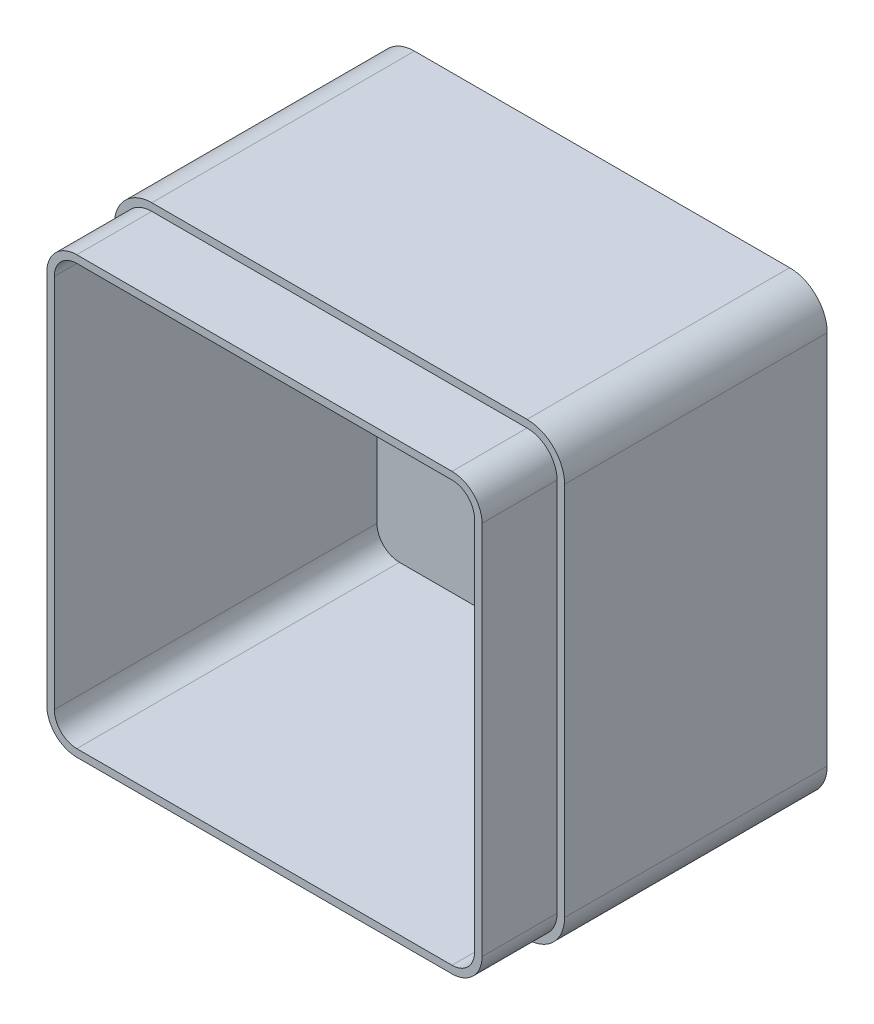
ISO-10303-21;
HEADER;
FILE_DESCRIPTION(('STEP AP214'),'2;1');
FILE_NAME('part.step','',(''),(''),'','','');
FILE_SCHEMA(('AUTOMOTIVE_DESIGN { 1 0 10303 214 1 1 1 1 }'));
ENDSEC;
DATA;
#1=APPLICATION_CONTEXT('core data for automotive mechanical design processes');
#2=APPLICATION_PROTOCOL_DEFINITION('international standard','automotive_design',2000,#1);
#3=PRODUCT_CONTEXT('',#1,'mechanical');
#4=PRODUCT('Part','Part','',(#3));
#5=PRODUCT_RELATED_PRODUCT_CATEGORY('part','',(#4));
#6=PRODUCT_DEFINITION_FORMATION('','',#4);
#7=PRODUCT_DEFINITION_CONTEXT('part definition',#1,'design');
#8=PRODUCT_DEFINITION('design','',#6,#7);
#9=PRODUCT_DEFINITION_SHAPE('','',#8);
#10=(LENGTH_UNIT() NAMED_UNIT(*) SI_UNIT(.MILLI.,.METRE.));
#11=(NAMED_UNIT(*) PLANE_ANGLE_UNIT() SI_UNIT($,.RADIAN.));
#12=(NAMED_UNIT(*) SI_UNIT($,.STERADIAN.) SOLID_ANGLE_UNIT());
#13=UNCERTAINTY_MEASURE_WITH_UNIT(LENGTH_MEASURE(1.E-05),#10,'distance_accuracy_value','');
#14=(GEOMETRIC_REPRESENTATION_CONTEXT(3) GLOBAL_UNCERTAINTY_ASSIGNED_CONTEXT((#13)) GLOBAL_UNIT_ASSIGNED_CONTEXT((#10,
#11,#12)) REPRESENTATION_CONTEXT('',''));
#15=CARTESIAN_POINT('',(0.,0.,0.));
#16=DIRECTION('',(0.,0.,1.));
#17=DIRECTION('',(1.,0.,0.));
#18=AXIS2_PLACEMENT_3D('',#15,#16,#17);
#19=CARTESIAN_POINT('',(0.,0.,90.));
#20=DIRECTION('',(0.,0.,-1.));
#21=DIRECTION('',(-1.,0.,0.));
#22=AXIS2_PLACEMENT_3D('',#19,#20,#21);
#23=PLANE('',#22);
#24=DIRECTION('',(0.,-1.,0.));
#25=VECTOR('',#24,1.);
#26=CARTESIAN_POINT('',(4.,0.,90.));
#27=LINE('',#26,#25);
#28=CARTESIAN_POINT('',(3.99999999999996,110.,90.));
#29=VERTEX_POINT('',#28);
#30=CARTESIAN_POINT('',(4.,10.,90.));
#31=VERTEX_POINT('',#30);
#32=EDGE_CURVE('E302',#29,#31,#27,.T.);
#33=ORIENTED_EDGE('',*,*,#32,.F.);
#34=CARTESIAN_POINT('',(9.99999999999996,110.,90.));
#35=DIRECTION('',(0.,0.,-1.));
#36=DIRECTION('',(-1.,0.,0.));
#37=AXIS2_PLACEMENT_3D('',#34,#35,#36);
#38=CIRCLE('',#37,6.);
#39=CARTESIAN_POINT('',(9.99999999999996,116.,90.));
#40=VERTEX_POINT('',#39);
#41=EDGE_CURVE('E331',#40,#29,#38,.F.);
#42=ORIENTED_EDGE('',*,*,#41,.F.);
#43=DIRECTION('',(-1.,0.,0.));
#44=VECTOR('',#43,1.);
#45=CARTESIAN_POINT('',(0.,116.,90.));
#46=LINE('',#45,#44);
#47=CARTESIAN_POINT('',(110.,116.,90.));
#48=VERTEX_POINT('',#47);
#49=EDGE_CURVE('E313',#48,#40,#46,.T.);
#50=ORIENTED_EDGE('',*,*,#49,.F.);
#51=CARTESIAN_POINT('',(110.,110.,90.));
#52=DIRECTION('',(0.,0.,-1.));
#53=DIRECTION('',(-1.,0.,0.));
#54=AXIS2_PLACEMENT_3D('',#51,#52,#53);
#55=CIRCLE('',#54,6.);
#56=CARTESIAN_POINT('',(116.,110.,90.));
#57=VERTEX_POINT('',#56);
#58=EDGE_CURVE('E287',#57,#48,#55,.F.);
#59=ORIENTED_EDGE('',*,*,#58,.F.);
#60=DIRECTION('',(0.,1.,0.));
#61=VECTOR('',#60,1.);
#62=CARTESIAN_POINT('',(116.,0.,90.));
#63=LINE('',#62,#61);
#64=CARTESIAN_POINT('',(116.,10.,90.));
#65=VERTEX_POINT('',#64);
#66=EDGE_CURVE('E334',#65,#57,#63,.T.);
#67=ORIENTED_EDGE('',*,*,#66,.F.);
#68=CARTESIAN_POINT('',(110.,10.,90.));
#69=DIRECTION('',(0.,0.,-1.));
#70=DIRECTION('',(-1.,0.,0.));
#71=AXIS2_PLACEMENT_3D('',#68,#69,#70);
#72=CIRCLE('',#71,6.);
#73=CARTESIAN_POINT('',(110.,4.,90.));
#74=VERTEX_POINT('',#73);
#75=EDGE_CURVE('E335',#74,#65,#72,.F.);
#76=ORIENTED_EDGE('',*,*,#75,.F.);
#77=DIRECTION('',(1.,0.,0.));
#78=VECTOR('',#77,1.);
#79=CARTESIAN_POINT('',(0.,4.,90.));
#80=LINE('',#79,#78);
#81=CARTESIAN_POINT('',(9.99999999999999,4.,90.));
#82=VERTEX_POINT('',#81);
#83=EDGE_CURVE('E329',#82,#74,#80,.T.);
#84=ORIENTED_EDGE('',*,*,#83,.F.);
#85=CARTESIAN_POINT('',(9.99999999999999,10.,90.));
#86=DIRECTION('',(0.,0.,-1.));
#87=DIRECTION('',(-1.,0.,0.));
#88=AXIS2_PLACEMENT_3D('',#85,#86,#87);
#89=CIRCLE('',#88,6.);
#90=EDGE_CURVE('E324',#31,#82,#89,.F.);
#91=ORIENTED_EDGE('',*,*,#90,.F.);
#92=EDGE_LOOP('',(#33,#42,#50,#59,#67,#76,#84,#91));
#93=FACE_BOUND('',#92,.T.);
#94=CARTESIAN_POINT('',(9.99999999999996,110.,90.));
#95=DIRECTION('',(0.,0.,1.));
#96=DIRECTION('',(1.,0.,0.));
#97=AXIS2_PLACEMENT_3D('',#94,#95,#96);
#98=CIRCLE('',#97,8.);
#99=CARTESIAN_POINT('',(9.99999999999995,118.,90.));
#100=VERTEX_POINT('',#99);
#101=CARTESIAN_POINT('',(1.99999999999996,110.,90.));
#102=VERTEX_POINT('',#101);
#103=EDGE_CURVE('E239',#100,#102,#98,.T.);
#104=ORIENTED_EDGE('',*,*,#103,.T.);
#105=DIRECTION('',(0.,-1.,0.));
#106=VECTOR('',#105,1.);
#107=CARTESIAN_POINT('',(1.99999999999996,110.,90.));
#108=LINE('',#107,#106);
#109=CARTESIAN_POINT('',(1.99999999999996,9.99999999999999,90.));
#110=VERTEX_POINT('',#109);
#111=EDGE_CURVE('E199',#102,#110,#108,.T.);
#112=ORIENTED_EDGE('',*,*,#111,.T.);
#113=CARTESIAN_POINT('',(9.99999999999999,10.,90.));
#114=DIRECTION('',(0.,0.,1.));
#115=DIRECTION('',(1.,0.,0.));
#116=AXIS2_PLACEMENT_3D('',#113,#114,#115);
#117=CIRCLE('',#116,8.00000000000001);
#118=CARTESIAN_POINT('',(9.99999999999999,1.99999999999998,90.));
#119=VERTEX_POINT('',#118);
#120=EDGE_CURVE('E48',#110,#119,#117,.T.);
#121=ORIENTED_EDGE('',*,*,#120,.T.);
#122=DIRECTION('',(1.,0.,0.));
#123=VECTOR('',#122,1.);
#124=CARTESIAN_POINT('',(9.99999999999999,2.,90.));
#125=LINE('',#124,#123);
#126=CARTESIAN_POINT('',(110.,2.,90.));
#127=VERTEX_POINT('',#126);
#128=EDGE_CURVE('E243',#119,#127,#125,.T.);
#129=ORIENTED_EDGE('',*,*,#128,.T.);
#130=CARTESIAN_POINT('',(110.,10.,90.));
#131=DIRECTION('',(0.,0.,1.));
#132=DIRECTION('',(1.,0.,0.));
#133=AXIS2_PLACEMENT_3D('',#130,#131,#132);
#134=CIRCLE('',#133,7.99999999999999);
#135=CARTESIAN_POINT('',(118.,10.,90.));
#136=VERTEX_POINT('',#135);
#137=EDGE_CURVE('E246',#127,#136,#134,.T.);
#138=ORIENTED_EDGE('',*,*,#137,.T.);
#139=DIRECTION('',(0.,1.,0.));
#140=VECTOR('',#139,1.);
#141=CARTESIAN_POINT('',(118.,9.99999999999999,90.));
#142=LINE('',#141,#140);
#143=CARTESIAN_POINT('',(118.,110.,90.));
#144=VERTEX_POINT('',#143);
#145=EDGE_CURVE('E249',#136,#144,#142,.T.);
#146=ORIENTED_EDGE('',*,*,#145,.T.);
#147=CARTESIAN_POINT('',(110.,110.,90.));
#148=DIRECTION('',(0.,0.,1.));
#149=DIRECTION('',(1.,0.,0.));
#150=AXIS2_PLACEMENT_3D('',#147,#148,#149);
#151=CIRCLE('',#150,8.00000000000001);
#152=CARTESIAN_POINT('',(110.,118.,90.));
#153=VERTEX_POINT('',#152);
#154=EDGE_CURVE('E222',#144,#153,#151,.T.);
#155=ORIENTED_EDGE('',*,*,#154,.T.);
#156=DIRECTION('',(-1.,0.,0.));
#157=VECTOR('',#156,1.);
#158=CARTESIAN_POINT('',(110.,118.,90.));
#159=LINE('',#158,#157);
#160=EDGE_CURVE('E219',#153,#100,#159,.T.);
#161=ORIENTED_EDGE('',*,*,#160,.T.);
#162=EDGE_LOOP('',(#104,#112,#121,#129,#138,#146,#155,#161));
#163=FACE_BOUND('',#162,.T.);
#164=ADVANCED_FACE('F33',(#93,#163),#23,.F.);
#165=CARTESIAN_POINT('',(4.,0.,90.));
#166=DIRECTION('',(1.,0.,0.));
#167=DIRECTION('',(0.,1.,0.));
#168=AXIS2_PLACEMENT_3D('',#165,#166,#167);
#169=PLANE('',#168);
#170=DIRECTION('',(0.,-1.,0.));
#171=VECTOR('',#170,1.);
#172=CARTESIAN_POINT('',(4.,0.,4.));
#173=LINE('',#172,#171);
#174=CARTESIAN_POINT('',(3.99999999999996,110.,4.));
#175=VERTEX_POINT('',#174);
#176=CARTESIAN_POINT('',(4.,10.,4.));
#177=VERTEX_POINT('',#176);
#178=EDGE_CURVE('E281',#175,#177,#173,.T.);
#179=ORIENTED_EDGE('',*,*,#178,.F.);
#180=DIRECTION('',(0.,0.,1.));
#181=VECTOR('',#180,1.);
#182=CARTESIAN_POINT('',(3.99999999999996,110.,90.));
#183=LINE('',#182,#181);
#184=EDGE_CURVE('E288',#29,#175,#183,.F.);
#185=ORIENTED_EDGE('',*,*,#184,.F.);
#186=ORIENTED_EDGE('',*,*,#32,.T.);
#187=DIRECTION('',(0.,0.,1.));
#188=VECTOR('',#187,1.);
#189=CARTESIAN_POINT('',(4.,10.,90.));
#190=LINE('',#189,#188);
#191=EDGE_CURVE('E285',#177,#31,#190,.T.);
#192=ORIENTED_EDGE('',*,*,#191,.F.);
#193=EDGE_LOOP('',(#179,#185,#186,#192));
#194=FACE_BOUND('',#193,.T.);
#195=ADVANCED_FACE('F427',(#194),#169,.T.);
#196=CARTESIAN_POINT('',(0.,4.,90.));
#197=DIRECTION('',(0.,1.,0.));
#198=DIRECTION('',(0.,0.,1.));
#199=AXIS2_PLACEMENT_3D('',#196,#197,#198);
#200=PLANE('',#199);
#201=ORIENTED_EDGE('',*,*,#83,.T.);
#202=DIRECTION('',(0.,0.,1.));
#203=VECTOR('',#202,1.);
#204=CARTESIAN_POINT('',(110.,4.,90.));
#205=LINE('',#204,#203);
#206=CARTESIAN_POINT('',(110.,4.,4.));
#207=VERTEX_POINT('',#206);
#208=EDGE_CURVE('E311',#207,#74,#205,.T.);
#209=ORIENTED_EDGE('',*,*,#208,.F.);
#210=DIRECTION('',(1.,0.,0.));
#211=VECTOR('',#210,1.);
#212=CARTESIAN_POINT('',(0.,4.,4.));
#213=LINE('',#212,#211);
#214=CARTESIAN_POINT('',(9.99999999999999,4.,4.));
#215=VERTEX_POINT('',#214);
#216=EDGE_CURVE('E284',#215,#207,#213,.T.);
#217=ORIENTED_EDGE('',*,*,#216,.F.);
#218=DIRECTION('',(0.,0.,1.));
#219=VECTOR('',#218,1.);
#220=CARTESIAN_POINT('',(9.99999999999999,4.,90.));
#221=LINE('',#220,#219);
#222=EDGE_CURVE('E305',#82,#215,#221,.F.);
#223=ORIENTED_EDGE('',*,*,#222,.F.);
#224=EDGE_LOOP('',(#201,#209,#217,#223));
#225=FACE_BOUND('',#224,.T.);
#226=ADVANCED_FACE('F432',(#225),#200,.T.);
#227=CARTESIAN_POINT('',(116.,0.,90.));
#228=DIRECTION('',(-1.,0.,0.));
#229=DIRECTION('',(0.,-1.,0.));
#230=AXIS2_PLACEMENT_3D('',#227,#228,#229);
#231=PLANE('',#230);
#232=ORIENTED_EDGE('',*,*,#66,.T.);
#233=DIRECTION('',(0.,0.,1.));
#234=VECTOR('',#233,1.);
#235=CARTESIAN_POINT('',(116.,110.,90.));
#236=LINE('',#235,#234);
#237=CARTESIAN_POINT('',(116.,110.,4.));
#238=VERTEX_POINT('',#237);
#239=EDGE_CURVE('E318',#238,#57,#236,.T.);
#240=ORIENTED_EDGE('',*,*,#239,.F.);
#241=DIRECTION('',(0.,1.,0.));
#242=VECTOR('',#241,1.);
#243=CARTESIAN_POINT('',(116.,0.,4.));
#244=LINE('',#243,#242);
#245=CARTESIAN_POINT('',(116.,10.,4.));
#246=VERTEX_POINT('',#245);
#247=EDGE_CURVE('E294',#246,#238,#244,.T.);
#248=ORIENTED_EDGE('',*,*,#247,.F.);
#249=DIRECTION('',(0.,0.,1.));
#250=VECTOR('',#249,1.);
#251=CARTESIAN_POINT('',(116.,10.,90.));
#252=LINE('',#251,#250);
#253=EDGE_CURVE('E314',#65,#246,#252,.F.);
#254=ORIENTED_EDGE('',*,*,#253,.F.);
#255=EDGE_LOOP('',(#232,#240,#248,#254));
#256=FACE_BOUND('',#255,.T.);
#257=ADVANCED_FACE('F461',(#256),#231,.T.);
#258=CARTESIAN_POINT('',(0.,116.,90.));
#259=DIRECTION('',(0.,-1.,0.));
#260=DIRECTION('',(0.,0.,-1.));
#261=AXIS2_PLACEMENT_3D('',#258,#259,#260);
#262=PLANE('',#261);
#263=DIRECTION('',(-1.,0.,0.));
#264=VECTOR('',#263,1.);
#265=CARTESIAN_POINT('',(0.,116.,4.));
#266=LINE('',#265,#264);
#267=CARTESIAN_POINT('',(110.,116.,4.));
#268=VERTEX_POINT('',#267);
#269=CARTESIAN_POINT('',(9.99999999999996,116.,4.));
#270=VERTEX_POINT('',#269);
#271=EDGE_CURVE('E299',#268,#270,#266,.T.);
#272=ORIENTED_EDGE('',*,*,#271,.F.);
#273=DIRECTION('',(0.,0.,-1.));
#274=VECTOR('',#273,1.);
#275=CARTESIAN_POINT('',(110.,116.,90.));
#276=LINE('',#275,#274);
#277=EDGE_CURVE('E321',#48,#268,#276,.T.);
#278=ORIENTED_EDGE('',*,*,#277,.F.);
#279=ORIENTED_EDGE('',*,*,#49,.T.);
#280=DIRECTION('',(0.,0.,-1.));
#281=VECTOR('',#280,1.);
#282=CARTESIAN_POINT('',(9.99999999999996,116.,90.));
#283=LINE('',#282,#281);
#284=EDGE_CURVE('E320',#270,#40,#283,.F.);
#285=ORIENTED_EDGE('',*,*,#284,.F.);
#286=EDGE_LOOP('',(#272,#278,#279,#285));
#287=FACE_BOUND('',#286,.T.);
#288=ADVANCED_FACE('F457',(#287),#262,.T.);
#289=CARTESIAN_POINT('',(0.,0.,4.));
#290=DIRECTION('',(0.,0.,-1.));
#291=DIRECTION('',(-1.,0.,0.));
#292=AXIS2_PLACEMENT_3D('',#289,#290,#291);
#293=PLANE('',#292);
#294=ORIENTED_EDGE('',*,*,#216,.T.);
#295=CARTESIAN_POINT('',(110.,10.,4.));
#296=DIRECTION('',(0.,0.,-1.));
#297=DIRECTION('',(-1.,0.,0.));
#298=AXIS2_PLACEMENT_3D('',#295,#296,#297);
#299=CIRCLE('',#298,6.);
#300=EDGE_CURVE('E298',#246,#207,#299,.T.);
#301=ORIENTED_EDGE('',*,*,#300,.F.);
#302=ORIENTED_EDGE('',*,*,#247,.T.);
#303=CARTESIAN_POINT('',(110.,110.,4.));
#304=DIRECTION('',(0.,0.,-1.));
#305=DIRECTION('',(-1.,0.,0.));
#306=AXIS2_PLACEMENT_3D('',#303,#304,#305);
#307=CIRCLE('',#306,6.);
#308=EDGE_CURVE('E303',#268,#238,#307,.T.);
#309=ORIENTED_EDGE('',*,*,#308,.F.);
#310=ORIENTED_EDGE('',*,*,#271,.T.);
#311=CARTESIAN_POINT('',(9.99999999999996,110.,4.));
#312=DIRECTION('',(0.,0.,-1.));
#313=DIRECTION('',(-1.,0.,0.));
#314=AXIS2_PLACEMENT_3D('',#311,#312,#313);
#315=CIRCLE('',#314,6.);
#316=EDGE_CURVE('E296',#175,#270,#315,.T.);
#317=ORIENTED_EDGE('',*,*,#316,.F.);
#318=ORIENTED_EDGE('',*,*,#178,.T.);
#319=CARTESIAN_POINT('',(9.99999999999999,10.,4.));
#320=DIRECTION('',(0.,0.,-1.));
#321=DIRECTION('',(-1.,0.,0.));
#322=AXIS2_PLACEMENT_3D('',#319,#320,#321);
#323=CIRCLE('',#322,6.);
#324=EDGE_CURVE('E291',#215,#177,#323,.T.);
#325=ORIENTED_EDGE('',*,*,#324,.F.);
#326=EDGE_LOOP('',(#294,#301,#302,#309,#310,#317,#318,#325));
#327=FACE_BOUND('',#326,.T.);
#328=ADVANCED_FACE('F453',(#327),#293,.F.);
#329=CARTESIAN_POINT('',(9.99999999999999,10.,90.));
#330=DIRECTION('',(0.,0.,-1.));
#331=DIRECTION('',(-1.,0.,0.));
#332=AXIS2_PLACEMENT_3D('',#329,#330,#331);
#333=CYLINDRICAL_SURFACE('',#332,6.);
#334=ORIENTED_EDGE('',*,*,#90,.T.);
#335=ORIENTED_EDGE('',*,*,#222,.T.);
#336=ORIENTED_EDGE('',*,*,#324,.T.);
#337=ORIENTED_EDGE('',*,*,#191,.T.);
#338=EDGE_LOOP('',(#334,#335,#336,#337));
#339=FACE_BOUND('',#338,.T.);
#340=ADVANCED_FACE('F449',(#339),#333,.F.);
#341=CARTESIAN_POINT('',(9.99999999999996,110.,90.));
#342=DIRECTION('',(0.,0.,-1.));
#343=DIRECTION('',(-1.,0.,0.));
#344=AXIS2_PLACEMENT_3D('',#341,#342,#343);
#345=CYLINDRICAL_SURFACE('',#344,6.);
#346=ORIENTED_EDGE('',*,*,#41,.T.);
#347=ORIENTED_EDGE('',*,*,#184,.T.);
#348=ORIENTED_EDGE('',*,*,#316,.T.);
#349=ORIENTED_EDGE('',*,*,#284,.T.);
#350=EDGE_LOOP('',(#346,#347,#348,#349));
#351=FACE_BOUND('',#350,.T.);
#352=ADVANCED_FACE('F445',(#351),#345,.F.);
#353=CARTESIAN_POINT('',(110.,10.,90.));
#354=DIRECTION('',(0.,0.,-1.));
#355=DIRECTION('',(-1.,0.,0.));
#356=AXIS2_PLACEMENT_3D('',#353,#354,#355);
#357=CYLINDRICAL_SURFACE('',#356,6.);
#358=ORIENTED_EDGE('',*,*,#75,.T.);
#359=ORIENTED_EDGE('',*,*,#253,.T.);
#360=ORIENTED_EDGE('',*,*,#300,.T.);
#361=ORIENTED_EDGE('',*,*,#208,.T.);
#362=EDGE_LOOP('',(#358,#359,#360,#361));
#363=FACE_BOUND('',#362,.T.);
#364=ADVANCED_FACE('F441',(#363),#357,.F.);
#365=CARTESIAN_POINT('',(110.,110.,90.));
#366=DIRECTION('',(0.,0.,-1.));
#367=DIRECTION('',(-1.,0.,0.));
#368=AXIS2_PLACEMENT_3D('',#365,#366,#367);
#369=CYLINDRICAL_SURFACE('',#368,6.);
#370=ORIENTED_EDGE('',*,*,#58,.T.);
#371=ORIENTED_EDGE('',*,*,#277,.T.);
#372=ORIENTED_EDGE('',*,*,#308,.T.);
#373=ORIENTED_EDGE('',*,*,#239,.T.);
#374=EDGE_LOOP('',(#370,#371,#372,#373));
#375=FACE_BOUND('',#374,.T.);
#376=ADVANCED_FACE('F438',(#375),#369,.F.);
#377=CARTESIAN_POINT('',(9.99999999999996,110.,70.));
#378=DIRECTION('',(0.,0.,1.));
#379=DIRECTION('',(1.,0.,0.));
#380=AXIS2_PLACEMENT_3D('',#377,#378,#379);
#381=PLANE('',#380);
#382=DIRECTION('',(-1.,0.,0.));
#383=VECTOR('',#382,1.);
#384=CARTESIAN_POINT('',(110.,118.,70.));
#385=LINE('',#384,#383);
#386=CARTESIAN_POINT('',(110.,118.,70.));
#387=VERTEX_POINT('',#386);
#388=CARTESIAN_POINT('',(9.99999999999995,118.,70.));
#389=VERTEX_POINT('',#388);
#390=EDGE_CURVE('E205',#387,#389,#385,.T.);
#391=ORIENTED_EDGE('',*,*,#390,.F.);
#392=CARTESIAN_POINT('',(110.,110.,70.));
#393=DIRECTION('',(0.,0.,1.));
#394=DIRECTION('',(1.,0.,0.));
#395=AXIS2_PLACEMENT_3D('',#392,#393,#394);
#396=CIRCLE('',#395,8.00000000000001);
#397=CARTESIAN_POINT('',(118.,110.,70.));
#398=VERTEX_POINT('',#397);
#399=EDGE_CURVE('E235',#398,#387,#396,.T.);
#400=ORIENTED_EDGE('',*,*,#399,.F.);
#401=DIRECTION('',(0.,1.,0.));
#402=VECTOR('',#401,1.);
#403=CARTESIAN_POINT('',(118.,9.99999999999999,70.));
#404=LINE('',#403,#402);
#405=CARTESIAN_POINT('',(118.,10.,70.));
#406=VERTEX_POINT('',#405);
#407=EDGE_CURVE('E232',#406,#398,#404,.T.);
#408=ORIENTED_EDGE('',*,*,#407,.F.);
#409=CARTESIAN_POINT('',(110.,10.,70.));
#410=DIRECTION('',(0.,0.,1.));
#411=DIRECTION('',(1.,0.,0.));
#412=AXIS2_PLACEMENT_3D('',#409,#410,#411);
#413=CIRCLE('',#412,7.99999999999999);
#414=CARTESIAN_POINT('',(110.,2.,70.));
#415=VERTEX_POINT('',#414);
#416=EDGE_CURVE('E229',#415,#406,#413,.T.);
#417=ORIENTED_EDGE('',*,*,#416,.F.);
#418=DIRECTION('',(1.,0.,0.));
#419=VECTOR('',#418,1.);
#420=CARTESIAN_POINT('',(9.99999999999999,2.,70.));
#421=LINE('',#420,#419);
#422=CARTESIAN_POINT('',(9.99999999999999,1.99999999999998,70.));
#423=VERTEX_POINT('',#422);
#424=EDGE_CURVE('E226',#423,#415,#421,.T.);
#425=ORIENTED_EDGE('',*,*,#424,.F.);
#426=CARTESIAN_POINT('',(9.99999999999999,10.,70.));
#427=DIRECTION('',(0.,0.,1.));
#428=DIRECTION('',(1.,0.,0.));
#429=AXIS2_PLACEMENT_3D('',#426,#427,#428);
#430=CIRCLE('',#429,8.00000000000001);
#431=CARTESIAN_POINT('',(1.99999999999996,9.99999999999999,70.));
#432=VERTEX_POINT('',#431);
#433=EDGE_CURVE('E215',#432,#423,#430,.T.);
#434=ORIENTED_EDGE('',*,*,#433,.F.);
#435=DIRECTION('',(0.,-1.,0.));
#436=VECTOR('',#435,1.);
#437=CARTESIAN_POINT('',(1.99999999999996,110.,70.));
#438=LINE('',#437,#436);
#439=CARTESIAN_POINT('',(1.99999999999996,110.,70.));
#440=VERTEX_POINT('',#439);
#441=EDGE_CURVE('E197',#440,#432,#438,.T.);
#442=ORIENTED_EDGE('',*,*,#441,.F.);
#443=CARTESIAN_POINT('',(9.99999999999996,110.,70.));
#444=DIRECTION('',(0.,0.,1.));
#445=DIRECTION('',(1.,0.,0.));
#446=AXIS2_PLACEMENT_3D('',#443,#444,#445);
#447=CIRCLE('',#446,8.);
#448=EDGE_CURVE('E211',#389,#440,#447,.T.);
#449=ORIENTED_EDGE('',*,*,#448,.F.);
#450=EDGE_LOOP('',(#391,#400,#408,#417,#425,#434,#442,#449));
#451=FACE_BOUND('',#450,.T.);
#452=CARTESIAN_POINT('',(9.99999999999996,110.,70.));
#453=DIRECTION('',(0.,0.,1.));
#454=DIRECTION('',(1.,0.,0.));
#455=AXIS2_PLACEMENT_3D('',#452,#453,#454);
#456=CIRCLE('',#455,10.);
#457=CARTESIAN_POINT('',(9.99999999999996,120.,70.));
#458=VERTEX_POINT('',#457);
#459=CARTESIAN_POINT('',(0.,110.,70.));
#460=VERTEX_POINT('',#459);
#461=EDGE_CURVE('E255',#458,#460,#456,.T.);
#462=ORIENTED_EDGE('',*,*,#461,.T.);
#463=DIRECTION('',(0.,-1.,0.));
#464=VECTOR('',#463,1.);
#465=CARTESIAN_POINT('',(0.,110.,70.));
#466=LINE('',#465,#464);
#467=CARTESIAN_POINT('',(0.,9.99999999999999,70.));
#468=VERTEX_POINT('',#467);
#469=EDGE_CURVE('E268',#460,#468,#466,.T.);
#470=ORIENTED_EDGE('',*,*,#469,.T.);
#471=CARTESIAN_POINT('',(9.99999999999999,10.,70.));
#472=DIRECTION('',(0.,0.,1.));
#473=DIRECTION('',(1.,0.,0.));
#474=AXIS2_PLACEMENT_3D('',#471,#472,#473);
#475=CIRCLE('',#474,10.);
#476=CARTESIAN_POINT('',(9.99999999999999,0.,70.));
#477=VERTEX_POINT('',#476);
#478=EDGE_CURVE('E270',#468,#477,#475,.T.);
#479=ORIENTED_EDGE('',*,*,#478,.T.);
#480=DIRECTION('',(1.,0.,0.));
#481=VECTOR('',#480,1.);
#482=CARTESIAN_POINT('',(9.99999999999999,0.,70.));
#483=LINE('',#482,#481);
#484=CARTESIAN_POINT('',(110.,0.,70.));
#485=VERTEX_POINT('',#484);
#486=EDGE_CURVE('E272',#477,#485,#483,.T.);
#487=ORIENTED_EDGE('',*,*,#486,.T.);
#488=CARTESIAN_POINT('',(110.,10.,70.));
#489=DIRECTION('',(0.,0.,1.));
#490=DIRECTION('',(1.,0.,0.));
#491=AXIS2_PLACEMENT_3D('',#488,#489,#490);
#492=CIRCLE('',#491,9.99999999999999);
#493=CARTESIAN_POINT('',(120.,10.,70.));
#494=VERTEX_POINT('',#493);
#495=EDGE_CURVE('E274',#485,#494,#492,.T.);
#496=ORIENTED_EDGE('',*,*,#495,.T.);
#497=DIRECTION('',(0.,1.,0.));
#498=VECTOR('',#497,1.);
#499=CARTESIAN_POINT('',(120.,10.,70.));
#500=LINE('',#499,#498);
#501=CARTESIAN_POINT('',(120.,110.,70.));
#502=VERTEX_POINT('',#501);
#503=EDGE_CURVE('E56',#494,#502,#500,.T.);
#504=ORIENTED_EDGE('',*,*,#503,.T.);
#505=CARTESIAN_POINT('',(110.,110.,70.));
#506=DIRECTION('',(0.,0.,1.));
#507=DIRECTION('',(1.,0.,0.));
#508=AXIS2_PLACEMENT_3D('',#505,#506,#507);
#509=CIRCLE('',#508,9.99999999999999);
#510=CARTESIAN_POINT('',(110.,120.,70.));
#511=VERTEX_POINT('',#510);
#512=EDGE_CURVE('E277',#502,#511,#509,.T.);
#513=ORIENTED_EDGE('',*,*,#512,.T.);
#514=DIRECTION('',(-1.,0.,0.));
#515=VECTOR('',#514,1.);
#516=CARTESIAN_POINT('',(110.,120.,70.));
#517=LINE('',#516,#515);
#518=EDGE_CURVE('E279',#511,#458,#517,.T.);
#519=ORIENTED_EDGE('',*,*,#518,.T.);
#520=EDGE_LOOP('',(#462,#470,#479,#487,#496,#504,#513,#519));
#521=FACE_BOUND('',#520,.T.);
#522=ADVANCED_FACE('F210',(#451,#521),#381,.T.);
#523=CARTESIAN_POINT('',(9.99999999999996,110.,70.));
#524=DIRECTION('',(0.,0.,1.));
#525=DIRECTION('',(1.,0.,0.));
#526=AXIS2_PLACEMENT_3D('',#523,#524,#525);
#527=CYLINDRICAL_SURFACE('',#526,8.);
#528=ORIENTED_EDGE('',*,*,#103,.F.);
#529=DIRECTION('',(0.,0.,1.));
#530=VECTOR('',#529,1.);
#531=CARTESIAN_POINT('',(9.99999999999995,118.,70.));
#532=LINE('',#531,#530);
#533=EDGE_CURVE('E218',#389,#100,#532,.T.);
#534=ORIENTED_EDGE('',*,*,#533,.F.);
#535=ORIENTED_EDGE('',*,*,#448,.T.);
#536=DIRECTION('',(0.,0.,1.));
#537=VECTOR('',#536,1.);
#538=CARTESIAN_POINT('',(1.99999999999996,110.,70.));
#539=LINE('',#538,#537);
#540=EDGE_CURVE('E194',#440,#102,#539,.T.);
#541=ORIENTED_EDGE('',*,*,#540,.T.);
#542=EDGE_LOOP('',(#528,#534,#535,#541));
#543=FACE_BOUND('',#542,.T.);
#544=ADVANCED_FACE('F217',(#543),#527,.T.);
#545=CARTESIAN_POINT('',(110.,118.,70.));
#546=DIRECTION('',(0.,1.,0.));
#547=DIRECTION('',(0.,0.,1.));
#548=AXIS2_PLACEMENT_3D('',#545,#546,#547);
#549=PLANE('',#548);
#550=ORIENTED_EDGE('',*,*,#160,.F.);
#551=DIRECTION('',(0.,0.,1.));
#552=VECTOR('',#551,1.);
#553=CARTESIAN_POINT('',(110.,118.,70.));
#554=LINE('',#553,#552);
#555=EDGE_CURVE('E256',#387,#153,#554,.T.);
#556=ORIENTED_EDGE('',*,*,#555,.F.);
#557=ORIENTED_EDGE('',*,*,#390,.T.);
#558=ORIENTED_EDGE('',*,*,#533,.T.);
#559=EDGE_LOOP('',(#550,#556,#557,#558));
#560=FACE_BOUND('',#559,.T.);
#561=ADVANCED_FACE('F472',(#560),#549,.T.);
#562=CARTESIAN_POINT('',(110.,110.,70.));
#563=DIRECTION('',(0.,0.,1.));
#564=DIRECTION('',(1.,0.,0.));
#565=AXIS2_PLACEMENT_3D('',#562,#563,#564);
#566=CYLINDRICAL_SURFACE('',#565,8.00000000000001);
#567=ORIENTED_EDGE('',*,*,#154,.F.);
#568=DIRECTION('',(0.,0.,1.));
#569=VECTOR('',#568,1.);
#570=CARTESIAN_POINT('',(118.,110.,70.));
#571=LINE('',#570,#569);
#572=EDGE_CURVE('E258',#398,#144,#571,.T.);
#573=ORIENTED_EDGE('',*,*,#572,.F.);
#574=ORIENTED_EDGE('',*,*,#399,.T.);
#575=ORIENTED_EDGE('',*,*,#555,.T.);
#576=EDGE_LOOP('',(#567,#573,#574,#575));
#577=FACE_BOUND('',#576,.T.);
#578=ADVANCED_FACE('F487',(#577),#566,.T.);
#579=CARTESIAN_POINT('',(118.,9.99999999999999,70.));
#580=DIRECTION('',(1.,0.,0.));
#581=DIRECTION('',(0.,0.,-1.));
#582=AXIS2_PLACEMENT_3D('',#579,#580,#581);
#583=PLANE('',#582);
#584=ORIENTED_EDGE('',*,*,#145,.F.);
#585=DIRECTION('',(0.,0.,1.));
#586=VECTOR('',#585,1.);
#587=CARTESIAN_POINT('',(118.,10.,70.));
#588=LINE('',#587,#586);
#589=EDGE_CURVE('E260',#406,#136,#588,.T.);
#590=ORIENTED_EDGE('',*,*,#589,.F.);
#591=ORIENTED_EDGE('',*,*,#407,.T.);
#592=ORIENTED_EDGE('',*,*,#572,.T.);
#593=EDGE_LOOP('',(#584,#590,#591,#592));
#594=FACE_BOUND('',#593,.T.);
#595=ADVANCED_FACE('F483',(#594),#583,.T.);
#596=CARTESIAN_POINT('',(110.,10.,70.));
#597=DIRECTION('',(0.,0.,1.));
#598=DIRECTION('',(1.,0.,0.));
#599=AXIS2_PLACEMENT_3D('',#596,#597,#598);
#600=CYLINDRICAL_SURFACE('',#599,7.99999999999999);
#601=ORIENTED_EDGE('',*,*,#137,.F.);
#602=DIRECTION('',(0.,0.,1.));
#603=VECTOR('',#602,1.);
#604=CARTESIAN_POINT('',(110.,2.,70.));
#605=LINE('',#604,#603);
#606=EDGE_CURVE('E262',#415,#127,#605,.T.);
#607=ORIENTED_EDGE('',*,*,#606,.F.);
#608=ORIENTED_EDGE('',*,*,#416,.T.);
#609=ORIENTED_EDGE('',*,*,#589,.T.);
#610=EDGE_LOOP('',(#601,#607,#608,#609));
#611=FACE_BOUND('',#610,.T.);
#612=ADVANCED_FACE('F479',(#611),#600,.T.);
#613=CARTESIAN_POINT('',(9.99999999999999,2.,70.));
#614=DIRECTION('',(0.,-1.,0.));
#615=DIRECTION('',(0.,0.,-1.));
#616=AXIS2_PLACEMENT_3D('',#613,#614,#615);
#617=PLANE('',#616);
#618=ORIENTED_EDGE('',*,*,#128,.F.);
#619=DIRECTION('',(0.,0.,1.));
#620=VECTOR('',#619,1.);
#621=CARTESIAN_POINT('',(9.99999999999999,1.99999999999998,70.));
#622=LINE('',#621,#620);
#623=EDGE_CURVE('E264',#423,#119,#622,.T.);
#624=ORIENTED_EDGE('',*,*,#623,.F.);
#625=ORIENTED_EDGE('',*,*,#424,.T.);
#626=ORIENTED_EDGE('',*,*,#606,.T.);
#627=EDGE_LOOP('',(#618,#624,#625,#626));
#628=FACE_BOUND('',#627,.T.);
#629=ADVANCED_FACE('F476',(#628),#617,.T.);
#630=CARTESIAN_POINT('',(9.99999999999999,10.,70.));
#631=DIRECTION('',(0.,0.,1.));
#632=DIRECTION('',(1.,0.,0.));
#633=AXIS2_PLACEMENT_3D('',#630,#631,#632);
#634=CYLINDRICAL_SURFACE('',#633,8.00000000000001);
#635=ORIENTED_EDGE('',*,*,#120,.F.);
#636=DIRECTION('',(0.,0.,1.));
#637=VECTOR('',#636,1.);
#638=CARTESIAN_POINT('',(1.99999999999996,9.99999999999999,70.));
#639=LINE('',#638,#637);
#640=EDGE_CURVE('E204',#432,#110,#639,.T.);
#641=ORIENTED_EDGE('',*,*,#640,.F.);
#642=ORIENTED_EDGE('',*,*,#433,.T.);
#643=ORIENTED_EDGE('',*,*,#623,.T.);
#644=EDGE_LOOP('',(#635,#641,#642,#643));
#645=FACE_BOUND('',#644,.T.);
#646=ADVANCED_FACE('F422',(#645),#634,.T.);
#647=CARTESIAN_POINT('',(1.99999999999996,110.,70.));
#648=DIRECTION('',(-1.,0.,0.));
#649=DIRECTION('',(0.,0.,1.));
#650=AXIS2_PLACEMENT_3D('',#647,#648,#649);
#651=PLANE('',#650);
#652=ORIENTED_EDGE('',*,*,#111,.F.);
#653=ORIENTED_EDGE('',*,*,#540,.F.);
#654=ORIENTED_EDGE('',*,*,#441,.T.);
#655=ORIENTED_EDGE('',*,*,#640,.T.);
#656=EDGE_LOOP('',(#652,#653,#654,#655));
#657=FACE_BOUND('',#656,.T.);
#658=ADVANCED_FACE('F196',(#657),#651,.T.);
#659=CARTESIAN_POINT('',(0.,0.,0.));
#660=DIRECTION('',(0.,0.,-1.));
#661=DIRECTION('',(-1.,0.,0.));
#662=AXIS2_PLACEMENT_3D('',#659,#660,#661);
#663=PLANE('',#662);
#664=DIRECTION('',(1.,0.,0.));
#665=VECTOR('',#664,1.);
#666=CARTESIAN_POINT('',(0.,0.,0.));
#667=LINE('',#666,#665);
#668=CARTESIAN_POINT('',(9.99999999999999,0.,0.));
#669=VERTEX_POINT('',#668);
#670=CARTESIAN_POINT('',(110.,0.,0.));
#671=VERTEX_POINT('',#670);
#672=EDGE_CURVE('E344',#669,#671,#667,.T.);
#673=ORIENTED_EDGE('',*,*,#672,.F.);
#674=CARTESIAN_POINT('',(9.99999999999999,10.,0.));
#675=DIRECTION('',(0.,0.,-1.));
#676=DIRECTION('',(-1.,0.,0.));
#677=AXIS2_PLACEMENT_3D('',#674,#675,#676);
#678=CIRCLE('',#677,10.);
#679=CARTESIAN_POINT('',(0.,9.99999999999999,0.));
#680=VERTEX_POINT('',#679);
#681=EDGE_CURVE('E364',#669,#680,#678,.T.);
#682=ORIENTED_EDGE('',*,*,#681,.T.);
#683=DIRECTION('',(0.,-1.,0.));
#684=VECTOR('',#683,1.);
#685=CARTESIAN_POINT('',(0.,0.,0.));
#686=LINE('',#685,#684);
#687=CARTESIAN_POINT('',(0.,110.,0.));
#688=VERTEX_POINT('',#687);
#689=EDGE_CURVE('E317',#688,#680,#686,.T.);
#690=ORIENTED_EDGE('',*,*,#689,.F.);
#691=CARTESIAN_POINT('',(9.99999999999996,110.,0.));
#692=DIRECTION('',(0.,0.,-1.));
#693=DIRECTION('',(-1.,0.,0.));
#694=AXIS2_PLACEMENT_3D('',#691,#692,#693);
#695=CIRCLE('',#694,10.);
#696=CARTESIAN_POINT('',(9.99999999999996,120.,0.));
#697=VERTEX_POINT('',#696);
#698=EDGE_CURVE('E362',#688,#697,#695,.T.);
#699=ORIENTED_EDGE('',*,*,#698,.T.);
#700=DIRECTION('',(-1.,0.,0.));
#701=VECTOR('',#700,1.);
#702=CARTESIAN_POINT('',(0.,120.,0.));
#703=LINE('',#702,#701);
#704=CARTESIAN_POINT('',(110.,120.,0.));
#705=VERTEX_POINT('',#704);
#706=EDGE_CURVE('E350',#705,#697,#703,.T.);
#707=ORIENTED_EDGE('',*,*,#706,.F.);
#708=CARTESIAN_POINT('',(110.,110.,0.));
#709=DIRECTION('',(0.,0.,-1.));
#710=DIRECTION('',(-1.,0.,0.));
#711=AXIS2_PLACEMENT_3D('',#708,#709,#710);
#712=CIRCLE('',#711,10.);
#713=CARTESIAN_POINT('',(120.,110.,0.));
#714=VERTEX_POINT('',#713);
#715=EDGE_CURVE('E358',#705,#714,#712,.T.);
#716=ORIENTED_EDGE('',*,*,#715,.T.);
#717=DIRECTION('',(0.,1.,0.));
#718=VECTOR('',#717,1.);
#719=CARTESIAN_POINT('',(120.,0.,0.));
#720=LINE('',#719,#718);
#721=CARTESIAN_POINT('',(120.,10.,0.));
#722=VERTEX_POINT('',#721);
#723=EDGE_CURVE('E347',#722,#714,#720,.T.);
#724=ORIENTED_EDGE('',*,*,#723,.F.);
#725=CARTESIAN_POINT('',(110.,10.,0.));
#726=DIRECTION('',(0.,0.,-1.));
#727=DIRECTION('',(-1.,0.,0.));
#728=AXIS2_PLACEMENT_3D('',#725,#726,#727);
#729=CIRCLE('',#728,10.);
#730=EDGE_CURVE('E360',#722,#671,#729,.T.);
#731=ORIENTED_EDGE('',*,*,#730,.T.);
#732=EDGE_LOOP('',(#673,#682,#690,#699,#707,#716,#724,#731));
#733=FACE_BOUND('',#732,.T.);
#734=ADVANCED_FACE('F414',(#733),#663,.T.);
#735=CARTESIAN_POINT('',(9.99999999999996,110.,90.));
#736=DIRECTION('',(0.,0.,-1.));
#737=DIRECTION('',(-1.,0.,0.));
#738=AXIS2_PLACEMENT_3D('',#735,#736,#737);
#739=CYLINDRICAL_SURFACE('',#738,10.);
#740=DIRECTION('',(0.,0.,-1.));
#741=VECTOR('',#740,1.);
#742=CARTESIAN_POINT('',(0.,110.,90.));
#743=LINE('',#742,#741);
#744=EDGE_CURVE('E366',#460,#688,#743,.T.);
#745=ORIENTED_EDGE('',*,*,#744,.F.);
#746=ORIENTED_EDGE('',*,*,#461,.F.);
#747=DIRECTION('',(0.,0.,-1.));
#748=VECTOR('',#747,1.);
#749=CARTESIAN_POINT('',(9.99999999999996,120.,90.));
#750=LINE('',#749,#748);
#751=EDGE_CURVE('E373',#697,#458,#750,.F.);
#752=ORIENTED_EDGE('',*,*,#751,.F.);
#753=ORIENTED_EDGE('',*,*,#698,.F.);
#754=EDGE_LOOP('',(#745,#746,#752,#753));
#755=FACE_BOUND('',#754,.T.);
#756=ADVANCED_FACE('F393',(#755),#739,.T.);
#757=CARTESIAN_POINT('',(110.,110.,90.));
#758=DIRECTION('',(0.,0.,-1.));
#759=DIRECTION('',(-1.,0.,0.));
#760=AXIS2_PLACEMENT_3D('',#757,#758,#759);
#761=CYLINDRICAL_SURFACE('',#760,10.);
#762=DIRECTION('',(0.,0.,-1.));
#763=VECTOR('',#762,1.);
#764=CARTESIAN_POINT('',(110.,120.,90.));
#765=LINE('',#764,#763);
#766=EDGE_CURVE('E371',#511,#705,#765,.T.);
#767=ORIENTED_EDGE('',*,*,#766,.F.);
#768=ORIENTED_EDGE('',*,*,#512,.F.);
#769=DIRECTION('',(0.,0.,-1.));
#770=VECTOR('',#769,1.);
#771=CARTESIAN_POINT('',(120.,110.,90.));
#772=LINE('',#771,#770);
#773=EDGE_CURVE('E41',#714,#502,#772,.F.);
#774=ORIENTED_EDGE('',*,*,#773,.F.);
#775=ORIENTED_EDGE('',*,*,#715,.F.);
#776=EDGE_LOOP('',(#767,#768,#774,#775));
#777=FACE_BOUND('',#776,.T.);
#778=ADVANCED_FACE('F35',(#777),#761,.T.);
#779=CARTESIAN_POINT('',(0.,120.,90.));
#780=DIRECTION('',(0.,-1.,0.));
#781=DIRECTION('',(0.,0.,-1.));
#782=AXIS2_PLACEMENT_3D('',#779,#780,#781);
#783=PLANE('',#782);
#784=ORIENTED_EDGE('',*,*,#518,.F.);
#785=ORIENTED_EDGE('',*,*,#766,.T.);
#786=ORIENTED_EDGE('',*,*,#706,.T.);
#787=ORIENTED_EDGE('',*,*,#751,.T.);
#788=EDGE_LOOP('',(#784,#785,#786,#787));
#789=FACE_BOUND('',#788,.T.);
#790=ADVANCED_FACE('F388',(#789),#783,.F.);
#791=CARTESIAN_POINT('',(110.,10.,90.));
#792=DIRECTION('',(0.,0.,-1.));
#793=DIRECTION('',(-1.,0.,0.));
#794=AXIS2_PLACEMENT_3D('',#791,#792,#793);
#795=CYLINDRICAL_SURFACE('',#794,10.);
#796=DIRECTION('',(0.,0.,-1.));
#797=VECTOR('',#796,1.);
#798=CARTESIAN_POINT('',(120.,10.,90.));
#799=LINE('',#798,#797);
#800=EDGE_CURVE('E11',#494,#722,#799,.T.);
#801=ORIENTED_EDGE('',*,*,#800,.F.);
#802=ORIENTED_EDGE('',*,*,#495,.F.);
#803=DIRECTION('',(0.,0.,-1.));
#804=VECTOR('',#803,1.);
#805=CARTESIAN_POINT('',(110.,0.,90.));
#806=LINE('',#805,#804);
#807=EDGE_CURVE('E353',#671,#485,#806,.F.);
#808=ORIENTED_EDGE('',*,*,#807,.F.);
#809=ORIENTED_EDGE('',*,*,#730,.F.);
#810=EDGE_LOOP('',(#801,#802,#808,#809));
#811=FACE_BOUND('',#810,.T.);
#812=ADVANCED_FACE('F412',(#811),#795,.T.);
#813=CARTESIAN_POINT('',(120.,0.,90.));
#814=DIRECTION('',(-1.,0.,0.));
#815=DIRECTION('',(0.,-1.,0.));
#816=AXIS2_PLACEMENT_3D('',#813,#814,#815);
#817=PLANE('',#816);
#818=ORIENTED_EDGE('',*,*,#503,.F.);
#819=ORIENTED_EDGE('',*,*,#800,.T.);
#820=ORIENTED_EDGE('',*,*,#723,.T.);
#821=ORIENTED_EDGE('',*,*,#773,.T.);
#822=EDGE_LOOP('',(#818,#819,#820,#821));
#823=FACE_BOUND('',#822,.T.);
#824=ADVANCED_FACE('F378',(#823),#817,.F.);
#825=CARTESIAN_POINT('',(9.99999999999999,10.,90.));
#826=DIRECTION('',(0.,0.,-1.));
#827=DIRECTION('',(-1.,0.,0.));
#828=AXIS2_PLACEMENT_3D('',#825,#826,#827);
#829=CYLINDRICAL_SURFACE('',#828,10.);
#830=DIRECTION('',(0.,0.,-1.));
#831=VECTOR('',#830,1.);
#832=CARTESIAN_POINT('',(9.99999999999999,0.,90.));
#833=LINE('',#832,#831);
#834=EDGE_CURVE('E356',#477,#669,#833,.T.);
#835=ORIENTED_EDGE('',*,*,#834,.F.);
#836=ORIENTED_EDGE('',*,*,#478,.F.);
#837=DIRECTION('',(0.,0.,-1.));
#838=VECTOR('',#837,1.);
#839=CARTESIAN_POINT('',(0.,9.99999999999999,90.));
#840=LINE('',#839,#838);
#841=EDGE_CURVE('E368',#680,#468,#840,.F.);
#842=ORIENTED_EDGE('',*,*,#841,.F.);
#843=ORIENTED_EDGE('',*,*,#681,.F.);
#844=EDGE_LOOP('',(#835,#836,#842,#843));
#845=FACE_BOUND('',#844,.T.);
#846=ADVANCED_FACE('F403',(#845),#829,.T.);
#847=CARTESIAN_POINT('',(0.,0.,90.));
#848=DIRECTION('',(0.,1.,0.));
#849=DIRECTION('',(0.,0.,1.));
#850=AXIS2_PLACEMENT_3D('',#847,#848,#849);
#851=PLANE('',#850);
#852=ORIENTED_EDGE('',*,*,#486,.F.);
#853=ORIENTED_EDGE('',*,*,#834,.T.);
#854=ORIENTED_EDGE('',*,*,#672,.T.);
#855=ORIENTED_EDGE('',*,*,#807,.T.);
#856=EDGE_LOOP('',(#852,#853,#854,#855));
#857=FACE_BOUND('',#856,.T.);
#858=ADVANCED_FACE('F408',(#857),#851,.F.);
#859=CARTESIAN_POINT('',(0.,0.,90.));
#860=DIRECTION('',(1.,0.,0.));
#861=DIRECTION('',(0.,1.,0.));
#862=AXIS2_PLACEMENT_3D('',#859,#860,#861);
#863=PLANE('',#862);
#864=ORIENTED_EDGE('',*,*,#469,.F.);
#865=ORIENTED_EDGE('',*,*,#744,.T.);
#866=ORIENTED_EDGE('',*,*,#689,.T.);
#867=ORIENTED_EDGE('',*,*,#841,.T.);
#868=EDGE_LOOP('',(#864,#865,#866,#867));
#869=FACE_BOUND('',#868,.T.);
#870=ADVANCED_FACE('F398',(#869),#863,.F.);
#871=CLOSED_SHELL('',(#164,#195,#226,#257,#288,#328,#340,#352,#364,#376,#522,#544,#561,#578,
#595,#612,#629,#646,#658,#734,#756,#778,#790,#812,#824,#846,#858,#870));
#872=MANIFOLD_SOLID_BREP('B2',#871);
#873=ADVANCED_BREP_SHAPE_REPRESENTATION('',(#18,#872),#14);
#874=SHAPE_DEFINITION_REPRESENTATION(#9,#873);
ENDSEC;
END-ISO-10303-21;
